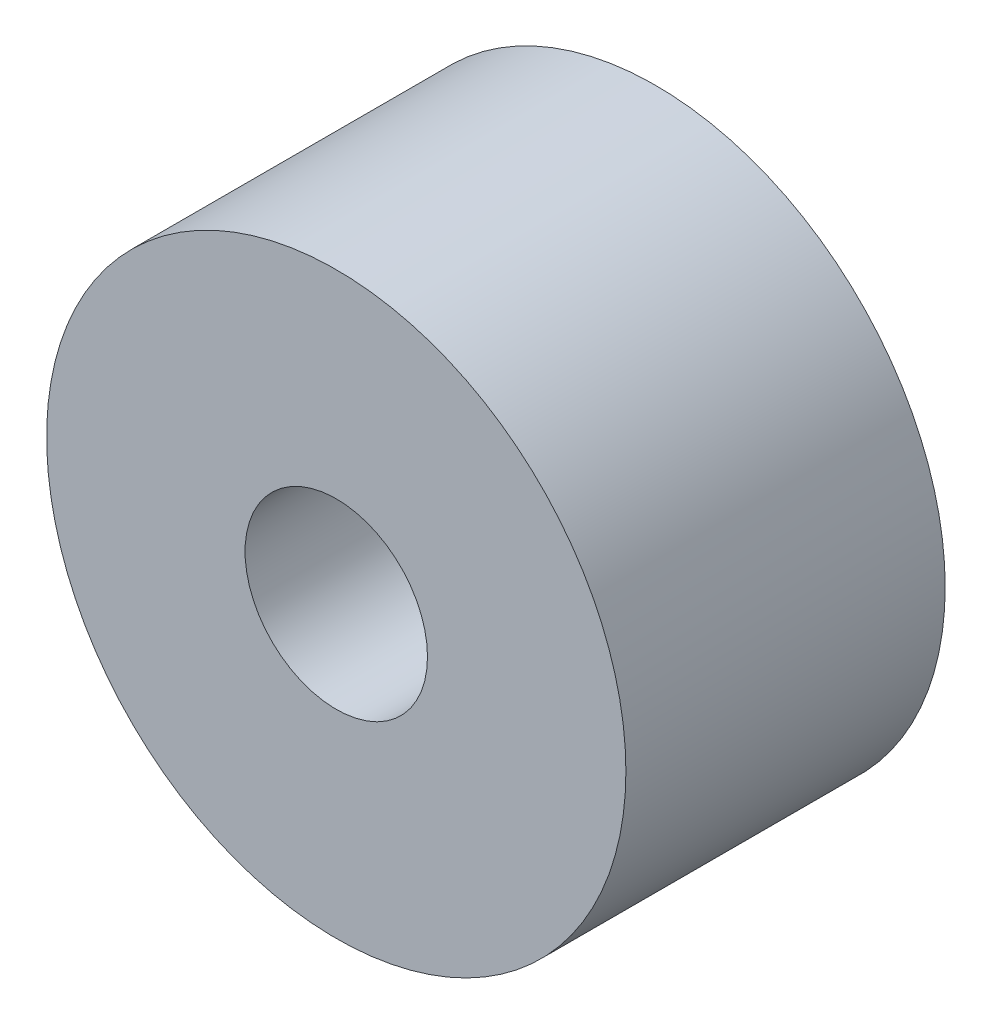
ISO-10303-21;
HEADER;
FILE_DESCRIPTION(('STEP AP214'),'2;1');
FILE_NAME('part.step','',(''),(''),'','','');
FILE_SCHEMA(('AUTOMOTIVE_DESIGN { 1 0 10303 214 1 1 1 1 }'));
ENDSEC;
DATA;
#1=APPLICATION_CONTEXT('core data for automotive mechanical design processes');
#2=APPLICATION_PROTOCOL_DEFINITION('international standard','automotive_design',2000,#1);
#3=PRODUCT_CONTEXT('',#1,'mechanical');
#4=PRODUCT('Part','Part','',(#3));
#5=PRODUCT_RELATED_PRODUCT_CATEGORY('part','',(#4));
#6=PRODUCT_DEFINITION_FORMATION('','',#4);
#7=PRODUCT_DEFINITION_CONTEXT('part definition',#1,'design');
#8=PRODUCT_DEFINITION('design','',#6,#7);
#9=PRODUCT_DEFINITION_SHAPE('','',#8);
#10=(LENGTH_UNIT() NAMED_UNIT(*) SI_UNIT(.MILLI.,.METRE.));
#11=(NAMED_UNIT(*) PLANE_ANGLE_UNIT() SI_UNIT($,.RADIAN.));
#12=(NAMED_UNIT(*) SI_UNIT($,.STERADIAN.) SOLID_ANGLE_UNIT());
#13=UNCERTAINTY_MEASURE_WITH_UNIT(LENGTH_MEASURE(1.E-05),#10,'distance_accuracy_value','');
#14=(GEOMETRIC_REPRESENTATION_CONTEXT(3) GLOBAL_UNCERTAINTY_ASSIGNED_CONTEXT((#13)) GLOBAL_UNIT_ASSIGNED_CONTEXT((#10,
#11,#12)) REPRESENTATION_CONTEXT('',''));
#15=CARTESIAN_POINT('',(0.,0.,0.));
#16=DIRECTION('',(0.,0.,1.));
#17=DIRECTION('',(1.,0.,0.));
#18=AXIS2_PLACEMENT_3D('',#15,#16,#17);
#19=CARTESIAN_POINT('',(0.,0.,2.));
#20=DIRECTION('',(0.,0.,-1.));
#21=DIRECTION('',(-1.,0.,0.));
#22=AXIS2_PLACEMENT_3D('',#19,#20,#21);
#23=CYLINDRICAL_SURFACE('',#22,12.7);
#24=CARTESIAN_POINT('',(0.,0.,0.));
#25=DIRECTION('',(0.,0.,1.));
#26=DIRECTION('',(1.,0.,0.));
#27=AXIS2_PLACEMENT_3D('',#24,#25,#26);
#28=CIRCLE('',#27,12.7);
#29=CARTESIAN_POINT('',(12.7,0.,0.));
#30=VERTEX_POINT('',#29);
#31=EDGE_CURVE('E44',#30,#30,#28,.T.);
#32=ORIENTED_EDGE('',*,*,#31,.T.);
#33=EDGE_LOOP('',(#32));
#34=FACE_BOUND('',#33,.T.);
#35=CARTESIAN_POINT('',(0.,0.,14.));
#36=DIRECTION('',(0.,0.,1.));
#37=DIRECTION('',(1.,0.,0.));
#38=AXIS2_PLACEMENT_3D('',#35,#36,#37);
#39=CIRCLE('',#38,12.7);
#40=CARTESIAN_POINT('',(12.7,0.,14.));
#41=VERTEX_POINT('',#40);
#42=EDGE_CURVE('E49',#41,#41,#39,.T.);
#43=ORIENTED_EDGE('',*,*,#42,.F.);
#44=EDGE_LOOP('',(#43));
#45=FACE_BOUND('',#44,.T.);
#46=ADVANCED_FACE('F37',(#34,#45),#23,.T.);
#47=CARTESIAN_POINT('',(0.,0.,0.));
#48=DIRECTION('',(0.,0.,1.));
#49=DIRECTION('',(1.,0.,0.));
#50=AXIS2_PLACEMENT_3D('',#47,#48,#49);
#51=PLANE('',#50);
#52=ORIENTED_EDGE('',*,*,#31,.F.);
#53=EDGE_LOOP('',(#52));
#54=FACE_BOUND('',#53,.T.);
#55=ADVANCED_FACE('F65',(#54),#51,.F.);
#56=CARTESIAN_POINT('',(0.,0.,14.));
#57=DIRECTION('',(0.,0.,1.));
#58=DIRECTION('',(1.,0.,0.));
#59=AXIS2_PLACEMENT_3D('',#56,#57,#58);
#60=PLANE('',#59);
#61=ORIENTED_EDGE('',*,*,#42,.T.);
#62=EDGE_LOOP('',(#61));
#63=FACE_BOUND('',#62,.T.);
#64=CARTESIAN_POINT('',(0.,0.,14.));
#65=DIRECTION('',(0.,0.,1.));
#66=DIRECTION('',(1.,0.,0.));
#67=AXIS2_PLACEMENT_3D('',#64,#65,#66);
#68=CIRCLE('',#67,4.);
#69=CARTESIAN_POINT('',(4.,0.,14.));
#70=VERTEX_POINT('',#69);
#71=EDGE_CURVE('E54',#70,#70,#68,.T.);
#72=ORIENTED_EDGE('',*,*,#71,.F.);
#73=EDGE_LOOP('',(#72));
#74=FACE_BOUND('',#73,.T.);
#75=ADVANCED_FACE('F63',(#63,#74),#60,.T.);
#76=CARTESIAN_POINT('',(0.,0.,14.));
#77=DIRECTION('',(0.,0.,-1.));
#78=DIRECTION('',(-1.,0.,0.));
#79=AXIS2_PLACEMENT_3D('',#76,#77,#78);
#80=CYLINDRICAL_SURFACE('',#79,4.);
#81=ORIENTED_EDGE('',*,*,#71,.T.);
#82=EDGE_LOOP('',(#81));
#83=FACE_BOUND('',#82,.T.);
#84=CARTESIAN_POINT('',(0.,0.,2.));
#85=DIRECTION('',(0.,0.,1.));
#86=DIRECTION('',(1.,0.,0.));
#87=AXIS2_PLACEMENT_3D('',#84,#85,#86);
#88=CIRCLE('',#87,4.);
#89=CARTESIAN_POINT('',(4.,0.,2.));
#90=VERTEX_POINT('',#89);
#91=EDGE_CURVE('E10',#90,#90,#88,.F.);
#92=ORIENTED_EDGE('',*,*,#91,.T.);
#93=EDGE_LOOP('',(#92));
#94=FACE_BOUND('',#93,.T.);
#95=ADVANCED_FACE('F61',(#83,#94),#80,.F.);
#96=CARTESIAN_POINT('',(0.,0.,2.));
#97=DIRECTION('',(0.,0.,1.));
#98=DIRECTION('',(1.,0.,0.));
#99=AXIS2_PLACEMENT_3D('',#96,#97,#98);
#100=PLANE('',#99);
#101=ORIENTED_EDGE('',*,*,#91,.F.);
#102=EDGE_LOOP('',(#101));
#103=FACE_BOUND('',#102,.T.);
#104=ADVANCED_FACE('F72',(#103),#100,.T.);
#105=CLOSED_SHELL('',(#46,#55,#75,#95,#104));
#106=MANIFOLD_SOLID_BREP('B2',#105);
#107=ADVANCED_BREP_SHAPE_REPRESENTATION('',(#18,#106),#14);
#108=SHAPE_DEFINITION_REPRESENTATION(#9,#107);
ENDSEC;
END-ISO-10303-21;
